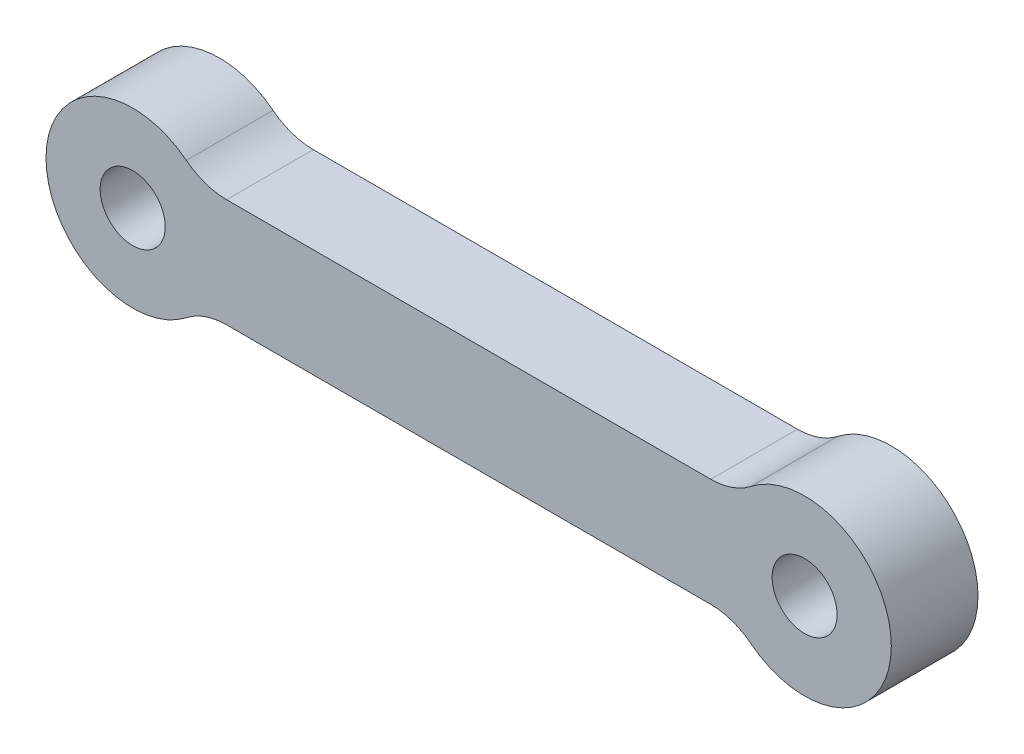
ISO-10303-21;
HEADER;
FILE_DESCRIPTION(('STEP AP214'),'2;1');
FILE_NAME('part.step','',(''),(''),'','','');
FILE_SCHEMA(('AUTOMOTIVE_DESIGN { 1 0 10303 214 1 1 1 1 }'));
ENDSEC;
DATA;
#1=APPLICATION_CONTEXT('core data for automotive mechanical design processes');
#2=APPLICATION_PROTOCOL_DEFINITION('international standard','automotive_design',2000,#1);
#3=PRODUCT_CONTEXT('',#1,'mechanical');
#4=PRODUCT('Part','Part','',(#3));
#5=PRODUCT_RELATED_PRODUCT_CATEGORY('part','',(#4));
#6=PRODUCT_DEFINITION_FORMATION('','',#4);
#7=PRODUCT_DEFINITION_CONTEXT('part definition',#1,'design');
#8=PRODUCT_DEFINITION('design','',#6,#7);
#9=PRODUCT_DEFINITION_SHAPE('','',#8);
#10=(LENGTH_UNIT() NAMED_UNIT(*) SI_UNIT(.MILLI.,.METRE.));
#11=(NAMED_UNIT(*) PLANE_ANGLE_UNIT() SI_UNIT($,.RADIAN.));
#12=(NAMED_UNIT(*) SI_UNIT($,.STERADIAN.) SOLID_ANGLE_UNIT());
#13=UNCERTAINTY_MEASURE_WITH_UNIT(LENGTH_MEASURE(1.E-05),#10,'distance_accuracy_value','');
#14=(GEOMETRIC_REPRESENTATION_CONTEXT(3) GLOBAL_UNCERTAINTY_ASSIGNED_CONTEXT((#13)) GLOBAL_UNIT_ASSIGNED_CONTEXT((#10,
#11,#12)) REPRESENTATION_CONTEXT('',''));
#15=CARTESIAN_POINT('',(0.,0.,0.));
#16=DIRECTION('',(0.,0.,1.));
#17=DIRECTION('',(1.,0.,0.));
#18=AXIS2_PLACEMENT_3D('',#15,#16,#17);
#19=CARTESIAN_POINT('',(11.1698729810778,-5.5,4.));
#20=DIRECTION('',(0.,0.,-1.));
#21=DIRECTION('',(-1.,0.,0.));
#22=AXIS2_PLACEMENT_3D('',#19,#20,#21);
#23=PLANE('',#22);
#24=CARTESIAN_POINT('',(11.1698729810778,-5.5,4.));
#25=DIRECTION('',(0.,0.,-1.));
#26=DIRECTION('',(-1.,0.,0.));
#27=AXIS2_PLACEMENT_3D('',#24,#25,#26);
#28=CIRCLE('',#27,3.);
#29=CARTESIAN_POINT('',(11.1698729810778,-2.5,4.));
#30=VERTEX_POINT('',#29);
#31=CARTESIAN_POINT('',(13.025641703473,-3.14285714285714,4.));
#32=VERTEX_POINT('',#31);
#33=EDGE_CURVE('E151',#30,#32,#28,.T.);
#34=ORIENTED_EDGE('',*,*,#33,.T.);
#35=CARTESIAN_POINT('',(15.5,0.,4.));
#36=DIRECTION('',(0.,0.,1.));
#37=DIRECTION('',(-1.,0.,0.));
#38=AXIS2_PLACEMENT_3D('',#35,#36,#37);
#39=CIRCLE('',#38,4.);
#40=CARTESIAN_POINT('',(13.025641703473,3.14285714285714,4.));
#41=VERTEX_POINT('',#40);
#42=EDGE_CURVE('E99',#32,#41,#39,.T.);
#43=ORIENTED_EDGE('',*,*,#42,.T.);
#44=CARTESIAN_POINT('',(11.1698729810778,5.5,4.));
#45=DIRECTION('',(0.,0.,-1.));
#46=DIRECTION('',(1.,0.,0.));
#47=AXIS2_PLACEMENT_3D('',#44,#45,#46);
#48=CIRCLE('',#47,3.);
#49=CARTESIAN_POINT('',(11.1698729810778,2.5,4.));
#50=VERTEX_POINT('',#49);
#51=EDGE_CURVE('E166',#41,#50,#48,.T.);
#52=ORIENTED_EDGE('',*,*,#51,.T.);
#53=DIRECTION('',(-1.,0.,0.));
#54=VECTOR('',#53,1.);
#55=CARTESIAN_POINT('',(-11.1698729810778,2.5,4.));
#56=LINE('',#55,#54);
#57=CARTESIAN_POINT('',(-11.1698729810778,2.5,4.));
#58=VERTEX_POINT('',#57);
#59=EDGE_CURVE('E179',#50,#58,#56,.T.);
#60=ORIENTED_EDGE('',*,*,#59,.T.);
#61=CARTESIAN_POINT('',(-11.1698729810778,5.5,4.));
#62=DIRECTION('',(0.,0.,-1.));
#63=DIRECTION('',(-1.,0.,0.));
#64=AXIS2_PLACEMENT_3D('',#61,#62,#63);
#65=CIRCLE('',#64,3.);
#66=CARTESIAN_POINT('',(-13.025641703473,3.14285714285714,4.));
#67=VERTEX_POINT('',#66);
#68=EDGE_CURVE('E118',#58,#67,#65,.T.);
#69=ORIENTED_EDGE('',*,*,#68,.T.);
#70=CARTESIAN_POINT('',(-15.5,0.,4.));
#71=DIRECTION('',(0.,0.,1.));
#72=DIRECTION('',(1.,0.,0.));
#73=AXIS2_PLACEMENT_3D('',#70,#71,#72);
#74=CIRCLE('',#73,4.);
#75=CARTESIAN_POINT('',(-13.025641703473,-3.14285714285714,4.));
#76=VERTEX_POINT('',#75);
#77=EDGE_CURVE('E112',#67,#76,#74,.T.);
#78=ORIENTED_EDGE('',*,*,#77,.T.);
#79=CARTESIAN_POINT('',(-11.1698729810778,-5.5,4.));
#80=DIRECTION('',(0.,0.,-1.));
#81=DIRECTION('',(-1.,0.,0.));
#82=AXIS2_PLACEMENT_3D('',#79,#80,#81);
#83=CIRCLE('',#82,3.);
#84=CARTESIAN_POINT('',(-11.1698729810778,-2.5,4.));
#85=VERTEX_POINT('',#84);
#86=EDGE_CURVE('E116',#76,#85,#83,.T.);
#87=ORIENTED_EDGE('',*,*,#86,.T.);
#88=DIRECTION('',(1.,0.,0.));
#89=VECTOR('',#88,1.);
#90=CARTESIAN_POINT('',(-11.1698729810778,-2.5,4.));
#91=LINE('',#90,#89);
#92=EDGE_CURVE('E56',#85,#30,#91,.T.);
#93=ORIENTED_EDGE('',*,*,#92,.T.);
#94=EDGE_LOOP('',(#34,#43,#52,#60,#69,#78,#87,#93));
#95=FACE_BOUND('',#94,.T.);
#96=CARTESIAN_POINT('',(-15.5,0.,4.));
#97=DIRECTION('',(0.,0.,1.));
#98=DIRECTION('',(1.,0.,0.));
#99=AXIS2_PLACEMENT_3D('',#96,#97,#98);
#100=CIRCLE('',#99,1.5);
#101=CARTESIAN_POINT('',(-14.,0.,4.));
#102=VERTEX_POINT('',#101);
#103=EDGE_CURVE('E140',#102,#102,#100,.T.);
#104=ORIENTED_EDGE('',*,*,#103,.F.);
#105=EDGE_LOOP('',(#104));
#106=FACE_BOUND('',#105,.T.);
#107=CARTESIAN_POINT('',(15.5,0.,4.));
#108=DIRECTION('',(0.,0.,1.));
#109=DIRECTION('',(-1.,0.,0.));
#110=AXIS2_PLACEMENT_3D('',#107,#108,#109);
#111=CIRCLE('',#110,1.5);
#112=CARTESIAN_POINT('',(14.,0.,4.));
#113=VERTEX_POINT('',#112);
#114=EDGE_CURVE('E188',#113,#113,#111,.T.);
#115=ORIENTED_EDGE('',*,*,#114,.F.);
#116=EDGE_LOOP('',(#115));
#117=FACE_BOUND('',#116,.T.);
#118=ADVANCED_FACE('F39',(#95,#106,#117),#23,.F.);
#119=CARTESIAN_POINT('',(11.1698729810778,-5.5,0.));
#120=DIRECTION('',(0.,0.,-1.));
#121=DIRECTION('',(-1.,0.,0.));
#122=AXIS2_PLACEMENT_3D('',#119,#120,#121);
#123=PLANE('',#122);
#124=CARTESIAN_POINT('',(-15.5,0.,0.));
#125=DIRECTION('',(0.,0.,1.));
#126=DIRECTION('',(1.,0.,0.));
#127=AXIS2_PLACEMENT_3D('',#124,#125,#126);
#128=CIRCLE('',#127,1.5);
#129=CARTESIAN_POINT('',(-14.,0.,0.));
#130=VERTEX_POINT('',#129);
#131=EDGE_CURVE('E185',#130,#130,#128,.T.);
#132=ORIENTED_EDGE('',*,*,#131,.T.);
#133=EDGE_LOOP('',(#132));
#134=FACE_BOUND('',#133,.T.);
#135=CARTESIAN_POINT('',(11.1698729810778,-5.5,0.));
#136=DIRECTION('',(0.,0.,-1.));
#137=DIRECTION('',(-1.,0.,0.));
#138=AXIS2_PLACEMENT_3D('',#135,#136,#137);
#139=CIRCLE('',#138,3.);
#140=CARTESIAN_POINT('',(11.1698729810778,-2.5,0.));
#141=VERTEX_POINT('',#140);
#142=CARTESIAN_POINT('',(13.025641703473,-3.14285714285714,0.));
#143=VERTEX_POINT('',#142);
#144=EDGE_CURVE('E136',#141,#143,#139,.T.);
#145=ORIENTED_EDGE('',*,*,#144,.F.);
#146=DIRECTION('',(1.,0.,0.));
#147=VECTOR('',#146,1.);
#148=CARTESIAN_POINT('',(-11.1698729810778,-2.5,0.));
#149=LINE('',#148,#147);
#150=CARTESIAN_POINT('',(-11.1698729810778,-2.5,0.));
#151=VERTEX_POINT('',#150);
#152=EDGE_CURVE('E91',#151,#141,#149,.T.);
#153=ORIENTED_EDGE('',*,*,#152,.F.);
#154=CARTESIAN_POINT('',(-11.1698729810778,-5.5,0.));
#155=DIRECTION('',(0.,0.,-1.));
#156=DIRECTION('',(-1.,0.,0.));
#157=AXIS2_PLACEMENT_3D('',#154,#155,#156);
#158=CIRCLE('',#157,3.);
#159=CARTESIAN_POINT('',(-13.025641703473,-3.14285714285714,0.));
#160=VERTEX_POINT('',#159);
#161=EDGE_CURVE('E85',#160,#151,#158,.T.);
#162=ORIENTED_EDGE('',*,*,#161,.F.);
#163=CARTESIAN_POINT('',(-15.5,0.,0.));
#164=DIRECTION('',(0.,0.,1.));
#165=DIRECTION('',(1.,0.,0.));
#166=AXIS2_PLACEMENT_3D('',#163,#164,#165);
#167=CIRCLE('',#166,4.);
#168=CARTESIAN_POINT('',(-13.025641703473,3.14285714285714,0.));
#169=VERTEX_POINT('',#168);
#170=EDGE_CURVE('E126',#169,#160,#167,.T.);
#171=ORIENTED_EDGE('',*,*,#170,.F.);
#172=CARTESIAN_POINT('',(-11.1698729810778,5.5,0.));
#173=DIRECTION('',(0.,0.,-1.));
#174=DIRECTION('',(-1.,0.,0.));
#175=AXIS2_PLACEMENT_3D('',#172,#173,#174);
#176=CIRCLE('',#175,3.);
#177=CARTESIAN_POINT('',(-11.1698729810778,2.5,0.));
#178=VERTEX_POINT('',#177);
#179=EDGE_CURVE('E146',#178,#169,#176,.T.);
#180=ORIENTED_EDGE('',*,*,#179,.F.);
#181=DIRECTION('',(-1.,0.,0.));
#182=VECTOR('',#181,1.);
#183=CARTESIAN_POINT('',(-11.1698729810778,2.5,0.));
#184=LINE('',#183,#182);
#185=CARTESIAN_POINT('',(11.1698729810778,2.5,0.));
#186=VERTEX_POINT('',#185);
#187=EDGE_CURVE('E144',#186,#178,#184,.T.);
#188=ORIENTED_EDGE('',*,*,#187,.F.);
#189=CARTESIAN_POINT('',(11.1698729810778,5.5,0.));
#190=DIRECTION('',(0.,0.,-1.));
#191=DIRECTION('',(1.,0.,0.));
#192=AXIS2_PLACEMENT_3D('',#189,#190,#191);
#193=CIRCLE('',#192,3.);
#194=CARTESIAN_POINT('',(13.025641703473,3.14285714285714,0.));
#195=VERTEX_POINT('',#194);
#196=EDGE_CURVE('E142',#195,#186,#193,.T.);
#197=ORIENTED_EDGE('',*,*,#196,.F.);
#198=CARTESIAN_POINT('',(15.5,0.,0.));
#199=DIRECTION('',(0.,0.,1.));
#200=DIRECTION('',(-1.,0.,0.));
#201=AXIS2_PLACEMENT_3D('',#198,#199,#200);
#202=CIRCLE('',#201,4.);
#203=EDGE_CURVE('E139',#143,#195,#202,.T.);
#204=ORIENTED_EDGE('',*,*,#203,.F.);
#205=EDGE_LOOP('',(#145,#153,#162,#171,#180,#188,#197,#204));
#206=FACE_BOUND('',#205,.T.);
#207=CARTESIAN_POINT('',(15.5,0.,0.));
#208=DIRECTION('',(0.,0.,1.));
#209=DIRECTION('',(-1.,0.,0.));
#210=AXIS2_PLACEMENT_3D('',#207,#208,#209);
#211=CIRCLE('',#210,1.5);
#212=CARTESIAN_POINT('',(14.,0.,0.));
#213=VERTEX_POINT('',#212);
#214=EDGE_CURVE('E191',#213,#213,#211,.T.);
#215=ORIENTED_EDGE('',*,*,#214,.T.);
#216=EDGE_LOOP('',(#215));
#217=FACE_BOUND('',#216,.T.);
#218=ADVANCED_FACE('F170',(#134,#206,#217),#123,.T.);
#219=CARTESIAN_POINT('',(11.1698729810778,-5.5,4.));
#220=DIRECTION('',(0.,0.,-1.));
#221=DIRECTION('',(-1.,0.,0.));
#222=AXIS2_PLACEMENT_3D('',#219,#220,#221);
#223=CYLINDRICAL_SURFACE('',#222,3.);
#224=ORIENTED_EDGE('',*,*,#144,.T.);
#225=DIRECTION('',(0.,0.,-1.));
#226=VECTOR('',#225,1.);
#227=CARTESIAN_POINT('',(13.025641703473,-3.14285714285714,4.));
#228=LINE('',#227,#226);
#229=EDGE_CURVE('E11',#32,#143,#228,.T.);
#230=ORIENTED_EDGE('',*,*,#229,.F.);
#231=ORIENTED_EDGE('',*,*,#33,.F.);
#232=DIRECTION('',(0.,0.,-1.));
#233=VECTOR('',#232,1.);
#234=CARTESIAN_POINT('',(11.1698729810778,-2.5,4.));
#235=LINE('',#234,#233);
#236=EDGE_CURVE('E132',#30,#141,#235,.T.);
#237=ORIENTED_EDGE('',*,*,#236,.T.);
#238=EDGE_LOOP('',(#224,#230,#231,#237));
#239=FACE_BOUND('',#238,.T.);
#240=ADVANCED_FACE('F41',(#239),#223,.F.);
#241=CARTESIAN_POINT('',(15.5,0.,4.));
#242=DIRECTION('',(0.,0.,-1.));
#243=DIRECTION('',(-1.,0.,0.));
#244=AXIS2_PLACEMENT_3D('',#241,#242,#243);
#245=CYLINDRICAL_SURFACE('',#244,4.);
#246=ORIENTED_EDGE('',*,*,#203,.T.);
#247=DIRECTION('',(0.,0.,-1.));
#248=VECTOR('',#247,1.);
#249=CARTESIAN_POINT('',(13.025641703473,3.14285714285714,4.));
#250=LINE('',#249,#248);
#251=EDGE_CURVE('E48',#41,#195,#250,.T.);
#252=ORIENTED_EDGE('',*,*,#251,.F.);
#253=ORIENTED_EDGE('',*,*,#42,.F.);
#254=ORIENTED_EDGE('',*,*,#229,.T.);
#255=EDGE_LOOP('',(#246,#252,#253,#254));
#256=FACE_BOUND('',#255,.T.);
#257=ADVANCED_FACE('F223',(#256),#245,.T.);
#258=CARTESIAN_POINT('',(11.1698729810778,5.5,4.));
#259=DIRECTION('',(0.,0.,-1.));
#260=DIRECTION('',(-1.,0.,0.));
#261=AXIS2_PLACEMENT_3D('',#258,#259,#260);
#262=CYLINDRICAL_SURFACE('',#261,3.);
#263=ORIENTED_EDGE('',*,*,#196,.T.);
#264=DIRECTION('',(0.,0.,-1.));
#265=VECTOR('',#264,1.);
#266=CARTESIAN_POINT('',(11.1698729810778,2.5,4.));
#267=LINE('',#266,#265);
#268=EDGE_CURVE('E158',#50,#186,#267,.T.);
#269=ORIENTED_EDGE('',*,*,#268,.F.);
#270=ORIENTED_EDGE('',*,*,#51,.F.);
#271=ORIENTED_EDGE('',*,*,#251,.T.);
#272=EDGE_LOOP('',(#263,#269,#270,#271));
#273=FACE_BOUND('',#272,.T.);
#274=ADVANCED_FACE('F164',(#273),#262,.F.);
#275=CARTESIAN_POINT('',(-11.1698729810778,2.5,4.));
#276=DIRECTION('',(0.,-1.,0.));
#277=DIRECTION('',(0.,0.,-1.));
#278=AXIS2_PLACEMENT_3D('',#275,#276,#277);
#279=PLANE('',#278);
#280=ORIENTED_EDGE('',*,*,#187,.T.);
#281=DIRECTION('',(0.,0.,-1.));
#282=VECTOR('',#281,1.);
#283=CARTESIAN_POINT('',(-11.1698729810778,2.5,4.));
#284=LINE('',#283,#282);
#285=EDGE_CURVE('E155',#58,#178,#284,.T.);
#286=ORIENTED_EDGE('',*,*,#285,.F.);
#287=ORIENTED_EDGE('',*,*,#59,.F.);
#288=ORIENTED_EDGE('',*,*,#268,.T.);
#289=EDGE_LOOP('',(#280,#286,#287,#288));
#290=FACE_BOUND('',#289,.T.);
#291=ADVANCED_FACE('F175',(#290),#279,.F.);
#292=CARTESIAN_POINT('',(-11.1698729810778,5.5,4.));
#293=DIRECTION('',(0.,0.,-1.));
#294=DIRECTION('',(-1.,0.,0.));
#295=AXIS2_PLACEMENT_3D('',#292,#293,#294);
#296=CYLINDRICAL_SURFACE('',#295,3.);
#297=ORIENTED_EDGE('',*,*,#179,.T.);
#298=DIRECTION('',(0.,0.,-1.));
#299=VECTOR('',#298,1.);
#300=CARTESIAN_POINT('',(-13.025641703473,3.14285714285714,4.));
#301=LINE('',#300,#299);
#302=EDGE_CURVE('E127',#67,#169,#301,.T.);
#303=ORIENTED_EDGE('',*,*,#302,.F.);
#304=ORIENTED_EDGE('',*,*,#68,.F.);
#305=ORIENTED_EDGE('',*,*,#285,.T.);
#306=EDGE_LOOP('',(#297,#303,#304,#305));
#307=FACE_BOUND('',#306,.T.);
#308=ADVANCED_FACE('F178',(#307),#296,.F.);
#309=CARTESIAN_POINT('',(-15.5,0.,4.));
#310=DIRECTION('',(0.,0.,-1.));
#311=DIRECTION('',(-1.,0.,0.));
#312=AXIS2_PLACEMENT_3D('',#309,#310,#311);
#313=CYLINDRICAL_SURFACE('',#312,4.);
#314=ORIENTED_EDGE('',*,*,#170,.T.);
#315=DIRECTION('',(0.,0.,-1.));
#316=VECTOR('',#315,1.);
#317=CARTESIAN_POINT('',(-13.025641703473,-3.14285714285714,4.));
#318=LINE('',#317,#316);
#319=EDGE_CURVE('E123',#76,#160,#318,.T.);
#320=ORIENTED_EDGE('',*,*,#319,.F.);
#321=ORIENTED_EDGE('',*,*,#77,.F.);
#322=ORIENTED_EDGE('',*,*,#302,.T.);
#323=EDGE_LOOP('',(#314,#320,#321,#322));
#324=FACE_BOUND('',#323,.T.);
#325=ADVANCED_FACE('F124',(#324),#313,.T.);
#326=CARTESIAN_POINT('',(-11.1698729810778,-5.5,4.));
#327=DIRECTION('',(0.,0.,-1.));
#328=DIRECTION('',(-1.,0.,0.));
#329=AXIS2_PLACEMENT_3D('',#326,#327,#328);
#330=CYLINDRICAL_SURFACE('',#329,3.);
#331=ORIENTED_EDGE('',*,*,#161,.T.);
#332=DIRECTION('',(0.,0.,-1.));
#333=VECTOR('',#332,1.);
#334=CARTESIAN_POINT('',(-11.1698729810778,-2.5,4.));
#335=LINE('',#334,#333);
#336=EDGE_CURVE('E128',#85,#151,#335,.T.);
#337=ORIENTED_EDGE('',*,*,#336,.F.);
#338=ORIENTED_EDGE('',*,*,#86,.F.);
#339=ORIENTED_EDGE('',*,*,#319,.T.);
#340=EDGE_LOOP('',(#331,#337,#338,#339));
#341=FACE_BOUND('',#340,.T.);
#342=ADVANCED_FACE('F130',(#341),#330,.F.);
#343=CARTESIAN_POINT('',(-11.1698729810778,-2.5,4.));
#344=DIRECTION('',(0.,1.,0.));
#345=DIRECTION('',(0.,0.,1.));
#346=AXIS2_PLACEMENT_3D('',#343,#344,#345);
#347=PLANE('',#346);
#348=ORIENTED_EDGE('',*,*,#152,.T.);
#349=ORIENTED_EDGE('',*,*,#236,.F.);
#350=ORIENTED_EDGE('',*,*,#92,.F.);
#351=ORIENTED_EDGE('',*,*,#336,.T.);
#352=EDGE_LOOP('',(#348,#349,#350,#351));
#353=FACE_BOUND('',#352,.T.);
#354=ADVANCED_FACE('F211',(#353),#347,.F.);
#355=CARTESIAN_POINT('',(-15.5,0.,4.));
#356=DIRECTION('',(0.,0.,-1.));
#357=DIRECTION('',(-1.,0.,0.));
#358=AXIS2_PLACEMENT_3D('',#355,#356,#357);
#359=CYLINDRICAL_SURFACE('',#358,1.5);
#360=ORIENTED_EDGE('',*,*,#103,.T.);
#361=EDGE_LOOP('',(#360));
#362=FACE_BOUND('',#361,.T.);
#363=ORIENTED_EDGE('',*,*,#131,.F.);
#364=EDGE_LOOP('',(#363));
#365=FACE_BOUND('',#364,.T.);
#366=ADVANCED_FACE('F208',(#362,#365),#359,.F.);
#367=CARTESIAN_POINT('',(15.5,0.,4.));
#368=DIRECTION('',(0.,0.,-1.));
#369=DIRECTION('',(-1.,0.,0.));
#370=AXIS2_PLACEMENT_3D('',#367,#368,#369);
#371=CYLINDRICAL_SURFACE('',#370,1.5);
#372=ORIENTED_EDGE('',*,*,#114,.T.);
#373=EDGE_LOOP('',(#372));
#374=FACE_BOUND('',#373,.T.);
#375=ORIENTED_EDGE('',*,*,#214,.F.);
#376=EDGE_LOOP('',(#375));
#377=FACE_BOUND('',#376,.T.);
#378=ADVANCED_FACE('F197',(#374,#377),#371,.F.);
#379=CLOSED_SHELL('',(#118,#218,#240,#257,#274,#291,#308,#325,#342,#354,#366,#378));
#380=MANIFOLD_SOLID_BREP('B2',#379);
#381=ADVANCED_BREP_SHAPE_REPRESENTATION('',(#18,#380),#14);
#382=SHAPE_DEFINITION_REPRESENTATION(#9,#381);
ENDSEC;
END-ISO-10303-21;
